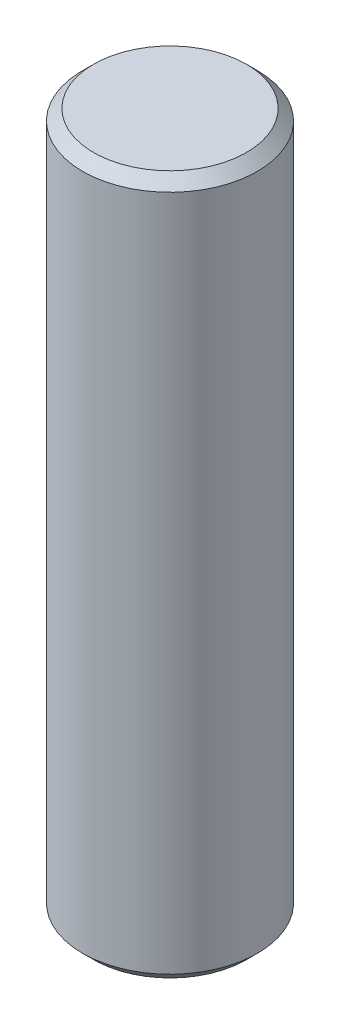
ISO-10303-21;
HEADER;
FILE_DESCRIPTION(('STEP AP214'),'2;1');
FILE_NAME('part.step','',(''),(''),'','','');
FILE_SCHEMA(('AUTOMOTIVE_DESIGN { 1 0 10303 214 1 1 1 1 }'));
ENDSEC;
DATA;
#1=APPLICATION_CONTEXT('core data for automotive mechanical design processes');
#2=APPLICATION_PROTOCOL_DEFINITION('international standard','automotive_design',2000,#1);
#3=PRODUCT_CONTEXT('',#1,'mechanical');
#4=PRODUCT('Part','Part','',(#3));
#5=PRODUCT_RELATED_PRODUCT_CATEGORY('part','',(#4));
#6=PRODUCT_DEFINITION_FORMATION('','',#4);
#7=PRODUCT_DEFINITION_CONTEXT('part definition',#1,'design');
#8=PRODUCT_DEFINITION('design','',#6,#7);
#9=PRODUCT_DEFINITION_SHAPE('','',#8);
#10=(LENGTH_UNIT() NAMED_UNIT(*) SI_UNIT(.MILLI.,.METRE.));
#11=(NAMED_UNIT(*) PLANE_ANGLE_UNIT() SI_UNIT($,.RADIAN.));
#12=(NAMED_UNIT(*) SI_UNIT($,.STERADIAN.) SOLID_ANGLE_UNIT());
#13=UNCERTAINTY_MEASURE_WITH_UNIT(LENGTH_MEASURE(1.E-05),#10,'distance_accuracy_value','');
#14=(GEOMETRIC_REPRESENTATION_CONTEXT(3) GLOBAL_UNCERTAINTY_ASSIGNED_CONTEXT((#13)) GLOBAL_UNIT_ASSIGNED_CONTEXT((#10,
#11,#12)) REPRESENTATION_CONTEXT('',''));
#15=CARTESIAN_POINT('',(0.,0.,0.));
#16=DIRECTION('',(0.,0.,1.));
#17=DIRECTION('',(1.,0.,0.));
#18=AXIS2_PLACEMENT_3D('',#15,#16,#17);
#19=CARTESIAN_POINT('',(0.,12.7,0.));
#20=DIRECTION('',(0.,-1.,0.));
#21=DIRECTION('',(0.,0.,-1.));
#22=AXIS2_PLACEMENT_3D('',#19,#20,#21);
#23=CONICAL_SURFACE('',#22,2.77876,0.785398163397448);
#24=CARTESIAN_POINT('',(0.,12.30376,0.));
#25=DIRECTION('',(0.,-1.,0.));
#26=DIRECTION('',(0.,0.,-1.));
#27=AXIS2_PLACEMENT_3D('',#24,#25,#26);
#28=CIRCLE('',#27,3.175);
#29=CARTESIAN_POINT('',(0.,12.30376,-3.175));
#30=VERTEX_POINT('',#29);
#31=EDGE_CURVE('E11',#30,#30,#28,.T.);
#32=ORIENTED_EDGE('',*,*,#31,.F.);
#33=EDGE_LOOP('',(#32));
#34=FACE_BOUND('',#33,.T.);
#35=CARTESIAN_POINT('',(0.,12.7,0.));
#36=DIRECTION('',(0.,-1.,0.));
#37=DIRECTION('',(0.,0.,-1.));
#38=AXIS2_PLACEMENT_3D('',#35,#36,#37);
#39=CIRCLE('',#38,2.77876);
#40=CARTESIAN_POINT('',(0.,12.7,-2.77876));
#41=VERTEX_POINT('',#40);
#42=EDGE_CURVE('E87',#41,#41,#39,.T.);
#43=ORIENTED_EDGE('',*,*,#42,.T.);
#44=EDGE_LOOP('',(#43));
#45=FACE_BOUND('',#44,.T.);
#46=ADVANCED_FACE('F68',(#34,#45),#23,.T.);
#47=CARTESIAN_POINT('',(0.,-12.7,0.));
#48=DIRECTION('',(0.,-1.,0.));
#49=DIRECTION('',(0.,0.,-1.));
#50=AXIS2_PLACEMENT_3D('',#47,#48,#49);
#51=CYLINDRICAL_SURFACE('',#50,3.175);
#52=CARTESIAN_POINT('',(0.,-12.30376,0.));
#53=DIRECTION('',(0.,-1.,0.));
#54=DIRECTION('',(0.,0.,-1.));
#55=AXIS2_PLACEMENT_3D('',#52,#53,#54);
#56=CIRCLE('',#55,3.175);
#57=CARTESIAN_POINT('',(0.,-12.30376,-3.175));
#58=VERTEX_POINT('',#57);
#59=EDGE_CURVE('E77',#58,#58,#56,.T.);
#60=ORIENTED_EDGE('',*,*,#59,.F.);
#61=EDGE_LOOP('',(#60));
#62=FACE_BOUND('',#61,.T.);
#63=ORIENTED_EDGE('',*,*,#31,.T.);
#64=EDGE_LOOP('',(#63));
#65=FACE_BOUND('',#64,.T.);
#66=ADVANCED_FACE('F106',(#62,#65),#51,.T.);
#67=CARTESIAN_POINT('',(0.,-12.30376,0.));
#68=DIRECTION('',(0.,1.,0.));
#69=DIRECTION('',(0.,0.,1.));
#70=AXIS2_PLACEMENT_3D('',#67,#68,#69);
#71=CONICAL_SURFACE('',#70,3.175,0.78539816339745);
#72=CARTESIAN_POINT('',(0.,-12.7,0.));
#73=DIRECTION('',(0.,-1.,0.));
#74=DIRECTION('',(0.,0.,-1.));
#75=AXIS2_PLACEMENT_3D('',#72,#73,#74);
#76=CIRCLE('',#75,2.77876);
#77=CARTESIAN_POINT('',(0.,-12.7,-2.77876));
#78=VERTEX_POINT('',#77);
#79=EDGE_CURVE('E81',#78,#78,#76,.T.);
#80=ORIENTED_EDGE('',*,*,#79,.F.);
#81=EDGE_LOOP('',(#80));
#82=FACE_BOUND('',#81,.T.);
#83=ORIENTED_EDGE('',*,*,#59,.T.);
#84=EDGE_LOOP('',(#83));
#85=FACE_BOUND('',#84,.T.);
#86=ADVANCED_FACE('F103',(#82,#85),#71,.T.);
#87=CARTESIAN_POINT('',(0.,-12.7,0.));
#88=DIRECTION('',(0.,1.,0.));
#89=DIRECTION('',(0.,0.,1.));
#90=AXIS2_PLACEMENT_3D('',#87,#88,#89);
#91=PLANE('',#90);
#92=ORIENTED_EDGE('',*,*,#79,.T.);
#93=EDGE_LOOP('',(#92));
#94=FACE_BOUND('',#93,.T.);
#95=ADVANCED_FACE('F99',(#94),#91,.F.);
#96=CARTESIAN_POINT('',(0.,12.7,2.77876));
#97=DIRECTION('',(0.,-1.,0.));
#98=DIRECTION('',(0.,0.,-1.));
#99=AXIS2_PLACEMENT_3D('',#96,#97,#98);
#100=PLANE('',#99);
#101=ORIENTED_EDGE('',*,*,#42,.F.);
#102=EDGE_LOOP('',(#101));
#103=FACE_BOUND('',#102,.T.);
#104=ADVANCED_FACE('F97',(#103),#100,.F.);
#105=CLOSED_SHELL('',(#46,#66,#86,#95,#104));
#106=MANIFOLD_SOLID_BREP('B2',#105);
#107=ADVANCED_BREP_SHAPE_REPRESENTATION('',(#18,#106),#14);
#108=SHAPE_DEFINITION_REPRESENTATION(#9,#107);
ENDSEC;
END-ISO-10303-21;
